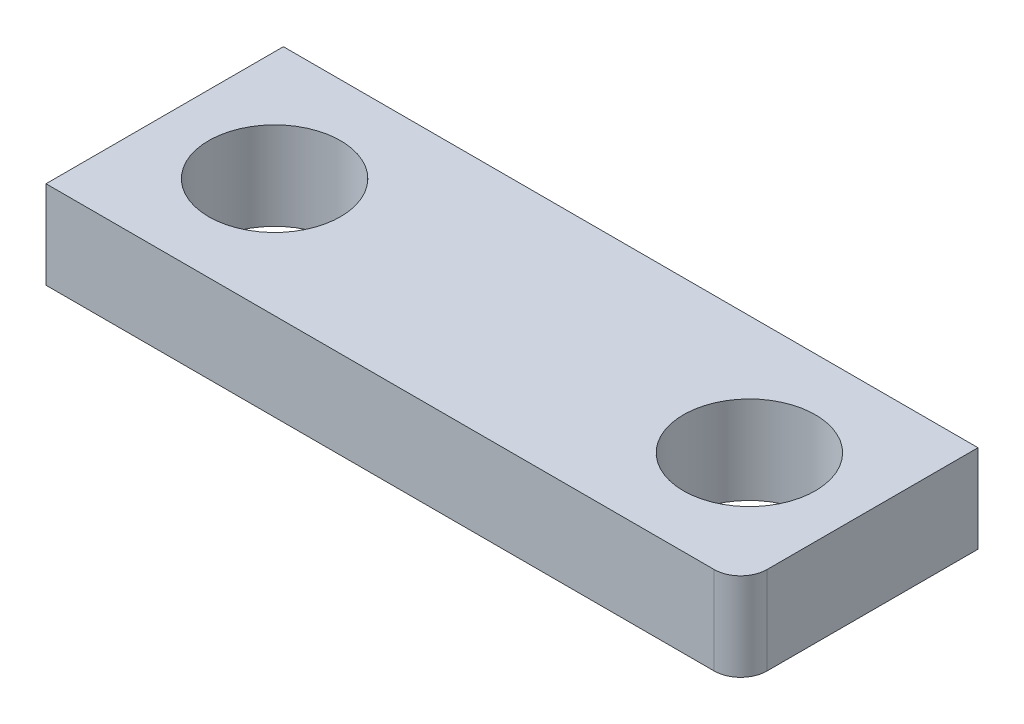
ISO-10303-21;
HEADER;
FILE_DESCRIPTION(('STEP AP214'),'2;1');
FILE_NAME('part.step','',(''),(''),'','','');
FILE_SCHEMA(('AUTOMOTIVE_DESIGN { 1 0 10303 214 1 1 1 1 }'));
ENDSEC;
DATA;
#1=APPLICATION_CONTEXT('core data for automotive mechanical design processes');
#2=APPLICATION_PROTOCOL_DEFINITION('international standard','automotive_design',2000,#1);
#3=PRODUCT_CONTEXT('',#1,'mechanical');
#4=PRODUCT('Part','Part','',(#3));
#5=PRODUCT_RELATED_PRODUCT_CATEGORY('part','',(#4));
#6=PRODUCT_DEFINITION_FORMATION('','',#4);
#7=PRODUCT_DEFINITION_CONTEXT('part definition',#1,'design');
#8=PRODUCT_DEFINITION('design','',#6,#7);
#9=PRODUCT_DEFINITION_SHAPE('','',#8);
#10=(LENGTH_UNIT() NAMED_UNIT(*) SI_UNIT(.MILLI.,.METRE.));
#11=(NAMED_UNIT(*) PLANE_ANGLE_UNIT() SI_UNIT($,.RADIAN.));
#12=(NAMED_UNIT(*) SI_UNIT($,.STERADIAN.) SOLID_ANGLE_UNIT());
#13=UNCERTAINTY_MEASURE_WITH_UNIT(LENGTH_MEASURE(1.E-05),#10,'distance_accuracy_value','');
#14=(GEOMETRIC_REPRESENTATION_CONTEXT(3) GLOBAL_UNCERTAINTY_ASSIGNED_CONTEXT((#13)) GLOBAL_UNIT_ASSIGNED_CONTEXT((#10,
#11,#12)) REPRESENTATION_CONTEXT('',''));
#15=CARTESIAN_POINT('',(0.,0.,0.));
#16=DIRECTION('',(0.,0.,1.));
#17=DIRECTION('',(1.,0.,0.));
#18=AXIS2_PLACEMENT_3D('',#15,#16,#17);
#19=CARTESIAN_POINT('',(39.5,10.,-13.5));
#20=DIRECTION('',(-1.,0.,0.));
#21=DIRECTION('',(0.,0.,1.));
#22=AXIS2_PLACEMENT_3D('',#19,#20,#21);
#23=PLANE('',#22);
#24=DIRECTION('',(0.,0.,-1.));
#25=VECTOR('',#24,1.);
#26=CARTESIAN_POINT('',(39.5,10.,-13.5));
#27=LINE('',#26,#25);
#28=CARTESIAN_POINT('',(39.5,10.,10.5));
#29=VERTEX_POINT('',#28);
#30=CARTESIAN_POINT('',(39.5,10.,-13.5));
#31=VERTEX_POINT('',#30);
#32=EDGE_CURVE('E81',#29,#31,#27,.T.);
#33=ORIENTED_EDGE('',*,*,#32,.F.);
#34=DIRECTION('',(0.,-1.,0.));
#35=VECTOR('',#34,1.);
#36=CARTESIAN_POINT('',(39.5,10.,10.5));
#37=LINE('',#36,#35);
#38=CARTESIAN_POINT('',(39.5,0.,10.5));
#39=VERTEX_POINT('',#38);
#40=EDGE_CURVE('E104',#29,#39,#37,.T.);
#41=ORIENTED_EDGE('',*,*,#40,.T.);
#42=DIRECTION('',(0.,0.,-1.));
#43=VECTOR('',#42,1.);
#44=CARTESIAN_POINT('',(39.5,0.,-13.5));
#45=LINE('',#44,#43);
#46=CARTESIAN_POINT('',(39.5,0.,-13.5));
#47=VERTEX_POINT('',#46);
#48=EDGE_CURVE('E102',#39,#47,#45,.T.);
#49=ORIENTED_EDGE('',*,*,#48,.T.);
#50=DIRECTION('',(0.,-1.,0.));
#51=VECTOR('',#50,1.);
#52=CARTESIAN_POINT('',(39.5,10.,-13.5));
#53=LINE('',#52,#51);
#54=EDGE_CURVE('E96',#31,#47,#53,.T.);
#55=ORIENTED_EDGE('',*,*,#54,.F.);
#56=EDGE_LOOP('',(#33,#41,#49,#55));
#57=FACE_BOUND('',#56,.T.);
#58=ADVANCED_FACE('F35',(#57),#23,.F.);
#59=CARTESIAN_POINT('',(-39.5,10.,-13.5));
#60=DIRECTION('',(0.,0.,1.));
#61=DIRECTION('',(1.,0.,0.));
#62=AXIS2_PLACEMENT_3D('',#59,#60,#61);
#63=PLANE('',#62);
#64=DIRECTION('',(-1.,0.,0.));
#65=VECTOR('',#64,1.);
#66=CARTESIAN_POINT('',(-39.5,0.,-13.5));
#67=LINE('',#66,#65);
#68=CARTESIAN_POINT('',(-39.5,0.,-13.5));
#69=VERTEX_POINT('',#68);
#70=EDGE_CURVE('E117',#47,#69,#67,.T.);
#71=ORIENTED_EDGE('',*,*,#70,.T.);
#72=DIRECTION('',(0.,-1.,0.));
#73=VECTOR('',#72,1.);
#74=CARTESIAN_POINT('',(-39.5,10.,-13.5));
#75=LINE('',#74,#73);
#76=CARTESIAN_POINT('',(-39.5,10.,-13.5));
#77=VERTEX_POINT('',#76);
#78=EDGE_CURVE('E98',#77,#69,#75,.T.);
#79=ORIENTED_EDGE('',*,*,#78,.F.);
#80=DIRECTION('',(-1.,0.,0.));
#81=VECTOR('',#80,1.);
#82=CARTESIAN_POINT('',(-39.5,10.,-13.5));
#83=LINE('',#82,#81);
#84=EDGE_CURVE('E84',#31,#77,#83,.T.);
#85=ORIENTED_EDGE('',*,*,#84,.F.);
#86=ORIENTED_EDGE('',*,*,#54,.T.);
#87=EDGE_LOOP('',(#71,#79,#85,#86));
#88=FACE_BOUND('',#87,.T.);
#89=ADVANCED_FACE('F95',(#88),#63,.F.);
#90=CARTESIAN_POINT('',(-39.5,10.,-13.5));
#91=DIRECTION('',(1.,0.,0.));
#92=DIRECTION('',(0.,0.,-1.));
#93=AXIS2_PLACEMENT_3D('',#90,#91,#92);
#94=PLANE('',#93);
#95=DIRECTION('',(0.,0.,1.));
#96=VECTOR('',#95,1.);
#97=CARTESIAN_POINT('',(-39.5,0.,-13.5));
#98=LINE('',#97,#96);
#99=CARTESIAN_POINT('',(-39.5,0.,13.5));
#100=VERTEX_POINT('',#99);
#101=EDGE_CURVE('E115',#69,#100,#98,.T.);
#102=ORIENTED_EDGE('',*,*,#101,.T.);
#103=DIRECTION('',(0.,-1.,0.));
#104=VECTOR('',#103,1.);
#105=CARTESIAN_POINT('',(-39.5,10.,13.5));
#106=LINE('',#105,#104);
#107=CARTESIAN_POINT('',(-39.5,10.,13.5));
#108=VERTEX_POINT('',#107);
#109=EDGE_CURVE('E107',#108,#100,#106,.T.);
#110=ORIENTED_EDGE('',*,*,#109,.F.);
#111=DIRECTION('',(0.,0.,1.));
#112=VECTOR('',#111,1.);
#113=CARTESIAN_POINT('',(-39.5,10.,-13.5));
#114=LINE('',#113,#112);
#115=EDGE_CURVE('E100',#77,#108,#114,.T.);
#116=ORIENTED_EDGE('',*,*,#115,.F.);
#117=ORIENTED_EDGE('',*,*,#78,.T.);
#118=EDGE_LOOP('',(#102,#110,#116,#117));
#119=FACE_BOUND('',#118,.T.);
#120=ADVANCED_FACE('F164',(#119),#94,.F.);
#121=CARTESIAN_POINT('',(-39.5,10.,13.5));
#122=DIRECTION('',(0.,0.,-1.));
#123=DIRECTION('',(-1.,0.,0.));
#124=AXIS2_PLACEMENT_3D('',#121,#122,#123);
#125=PLANE('',#124);
#126=DIRECTION('',(1.,0.,0.));
#127=VECTOR('',#126,1.);
#128=CARTESIAN_POINT('',(-39.5,0.,13.5));
#129=LINE('',#128,#127);
#130=CARTESIAN_POINT('',(36.5,0.,13.5));
#131=VERTEX_POINT('',#130);
#132=EDGE_CURVE('E91',#100,#131,#129,.T.);
#133=ORIENTED_EDGE('',*,*,#132,.T.);
#134=DIRECTION('',(0.,-1.,0.));
#135=VECTOR('',#134,1.);
#136=CARTESIAN_POINT('',(36.5,10.,13.5));
#137=LINE('',#136,#135);
#138=CARTESIAN_POINT('',(36.5,10.,13.5));
#139=VERTEX_POINT('',#138);
#140=EDGE_CURVE('E43',#131,#139,#137,.F.);
#141=ORIENTED_EDGE('',*,*,#140,.T.);
#142=DIRECTION('',(1.,0.,0.));
#143=VECTOR('',#142,1.);
#144=CARTESIAN_POINT('',(-39.5,10.,13.5));
#145=LINE('',#144,#143);
#146=EDGE_CURVE('E113',#108,#139,#145,.T.);
#147=ORIENTED_EDGE('',*,*,#146,.F.);
#148=ORIENTED_EDGE('',*,*,#109,.T.);
#149=EDGE_LOOP('',(#133,#141,#147,#148));
#150=FACE_BOUND('',#149,.T.);
#151=ADVANCED_FACE('F140',(#150),#125,.F.);
#152=CARTESIAN_POINT('',(0.,10.,0.));
#153=DIRECTION('',(0.,1.,0.));
#154=DIRECTION('',(0.,0.,1.));
#155=AXIS2_PLACEMENT_3D('',#152,#153,#154);
#156=PLANE('',#155);
#157=CARTESIAN_POINT('',(-27.,10.,0.));
#158=DIRECTION('',(0.,1.,0.));
#159=DIRECTION('',(0.,0.,1.));
#160=AXIS2_PLACEMENT_3D('',#157,#158,#159);
#161=CIRCLE('',#160,7.5);
#162=CARTESIAN_POINT('',(-27.,10.,7.5));
#163=VERTEX_POINT('',#162);
#164=EDGE_CURVE('E126',#163,#163,#161,.T.);
#165=ORIENTED_EDGE('',*,*,#164,.F.);
#166=EDGE_LOOP('',(#165));
#167=FACE_BOUND('',#166,.T.);
#168=CARTESIAN_POINT('',(27.,10.,0.));
#169=DIRECTION('',(0.,1.,0.));
#170=DIRECTION('',(0.,0.,1.));
#171=AXIS2_PLACEMENT_3D('',#168,#169,#170);
#172=CIRCLE('',#171,7.5);
#173=CARTESIAN_POINT('',(27.,10.,7.5));
#174=VERTEX_POINT('',#173);
#175=EDGE_CURVE('E123',#174,#174,#172,.T.);
#176=ORIENTED_EDGE('',*,*,#175,.F.);
#177=EDGE_LOOP('',(#176));
#178=FACE_BOUND('',#177,.T.);
#179=ORIENTED_EDGE('',*,*,#146,.T.);
#180=CARTESIAN_POINT('',(36.5,10.,10.5));
#181=DIRECTION('',(0.,1.,0.));
#182=DIRECTION('',(0.,0.,1.));
#183=AXIS2_PLACEMENT_3D('',#180,#181,#182);
#184=CIRCLE('',#183,3.);
#185=EDGE_CURVE('E11',#139,#29,#184,.T.);
#186=ORIENTED_EDGE('',*,*,#185,.T.);
#187=ORIENTED_EDGE('',*,*,#32,.T.);
#188=ORIENTED_EDGE('',*,*,#84,.T.);
#189=ORIENTED_EDGE('',*,*,#115,.T.);
#190=EDGE_LOOP('',(#179,#186,#187,#188,#189));
#191=FACE_BOUND('',#190,.T.);
#192=ADVANCED_FACE('F83',(#167,#178,#191),#156,.T.);
#193=CARTESIAN_POINT('',(0.,0.,0.));
#194=DIRECTION('',(0.,1.,0.));
#195=DIRECTION('',(0.,0.,1.));
#196=AXIS2_PLACEMENT_3D('',#193,#194,#195);
#197=PLANE('',#196);
#198=CARTESIAN_POINT('',(-27.,0.,0.));
#199=DIRECTION('',(0.,1.,0.));
#200=DIRECTION('',(0.,0.,1.));
#201=AXIS2_PLACEMENT_3D('',#198,#199,#200);
#202=CIRCLE('',#201,7.5);
#203=CARTESIAN_POINT('',(-27.,0.,7.5));
#204=VERTEX_POINT('',#203);
#205=EDGE_CURVE('E129',#204,#204,#202,.T.);
#206=ORIENTED_EDGE('',*,*,#205,.T.);
#207=EDGE_LOOP('',(#206));
#208=FACE_BOUND('',#207,.T.);
#209=CARTESIAN_POINT('',(27.,0.,0.));
#210=DIRECTION('',(0.,1.,0.));
#211=DIRECTION('',(0.,0.,1.));
#212=AXIS2_PLACEMENT_3D('',#209,#210,#211);
#213=CIRCLE('',#212,7.5);
#214=CARTESIAN_POINT('',(27.,0.,7.5));
#215=VERTEX_POINT('',#214);
#216=EDGE_CURVE('E120',#215,#215,#213,.T.);
#217=ORIENTED_EDGE('',*,*,#216,.T.);
#218=EDGE_LOOP('',(#217));
#219=FACE_BOUND('',#218,.T.);
#220=ORIENTED_EDGE('',*,*,#48,.F.);
#221=CARTESIAN_POINT('',(36.5,0.,10.5));
#222=DIRECTION('',(0.,1.,0.));
#223=DIRECTION('',(0.,0.,1.));
#224=AXIS2_PLACEMENT_3D('',#221,#222,#223);
#225=CIRCLE('',#224,3.);
#226=EDGE_CURVE('E57',#39,#131,#225,.F.);
#227=ORIENTED_EDGE('',*,*,#226,.T.);
#228=ORIENTED_EDGE('',*,*,#132,.F.);
#229=ORIENTED_EDGE('',*,*,#101,.F.);
#230=ORIENTED_EDGE('',*,*,#70,.F.);
#231=EDGE_LOOP('',(#220,#227,#228,#229,#230));
#232=FACE_BOUND('',#231,.T.);
#233=ADVANCED_FACE('F139',(#208,#219,#232),#197,.F.);
#234=CARTESIAN_POINT('',(27.,0.,0.));
#235=DIRECTION('',(0.,1.,0.));
#236=DIRECTION('',(0.,0.,1.));
#237=AXIS2_PLACEMENT_3D('',#234,#235,#236);
#238=CYLINDRICAL_SURFACE('',#237,7.5);
#239=ORIENTED_EDGE('',*,*,#216,.F.);
#240=EDGE_LOOP('',(#239));
#241=FACE_BOUND('',#240,.T.);
#242=ORIENTED_EDGE('',*,*,#175,.T.);
#243=EDGE_LOOP('',(#242));
#244=FACE_BOUND('',#243,.T.);
#245=ADVANCED_FACE('F144',(#241,#244),#238,.F.);
#246=CARTESIAN_POINT('',(-27.,0.,0.));
#247=DIRECTION('',(0.,1.,0.));
#248=DIRECTION('',(0.,0.,1.));
#249=AXIS2_PLACEMENT_3D('',#246,#247,#248);
#250=CYLINDRICAL_SURFACE('',#249,7.5);
#251=ORIENTED_EDGE('',*,*,#205,.F.);
#252=EDGE_LOOP('',(#251));
#253=FACE_BOUND('',#252,.T.);
#254=ORIENTED_EDGE('',*,*,#164,.T.);
#255=EDGE_LOOP('',(#254));
#256=FACE_BOUND('',#255,.T.);
#257=ADVANCED_FACE('F135',(#253,#256),#250,.F.);
#258=CARTESIAN_POINT('',(36.5,10.,10.5));
#259=DIRECTION('',(0.,-1.,0.));
#260=DIRECTION('',(0.,0.,-1.));
#261=AXIS2_PLACEMENT_3D('',#258,#259,#260);
#262=CYLINDRICAL_SURFACE('',#261,3.);
#263=ORIENTED_EDGE('',*,*,#185,.F.);
#264=ORIENTED_EDGE('',*,*,#140,.F.);
#265=ORIENTED_EDGE('',*,*,#226,.F.);
#266=ORIENTED_EDGE('',*,*,#40,.F.);
#267=EDGE_LOOP('',(#263,#264,#265,#266));
#268=FACE_BOUND('',#267,.T.);
#269=ADVANCED_FACE('F37',(#268),#262,.T.);
#270=CLOSED_SHELL('',(#58,#89,#120,#151,#192,#233,#245,#257,#269));
#271=MANIFOLD_SOLID_BREP('B2',#270);
#272=ADVANCED_BREP_SHAPE_REPRESENTATION('',(#18,#271),#14);
#273=SHAPE_DEFINITION_REPRESENTATION(#9,#272);
ENDSEC;
END-ISO-10303-21;
